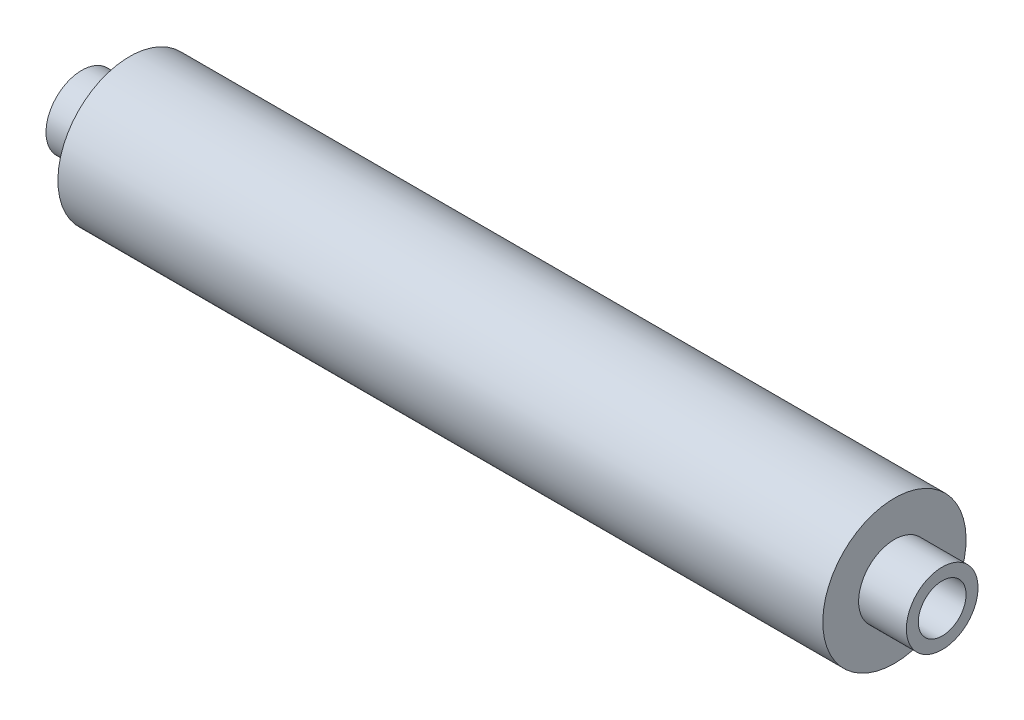
ISO-10303-21;
HEADER;
FILE_DESCRIPTION(('STEP AP214'),'2;1');
FILE_NAME('part.step','',(''),(''),'','','');
FILE_SCHEMA(('AUTOMOTIVE_DESIGN { 1 0 10303 214 1 1 1 1 }'));
ENDSEC;
DATA;
#1=APPLICATION_CONTEXT('core data for automotive mechanical design processes');
#2=APPLICATION_PROTOCOL_DEFINITION('international standard','automotive_design',2000,#1);
#3=PRODUCT_CONTEXT('',#1,'mechanical');
#4=PRODUCT('Part','Part','',(#3));
#5=PRODUCT_RELATED_PRODUCT_CATEGORY('part','',(#4));
#6=PRODUCT_DEFINITION_FORMATION('','',#4);
#7=PRODUCT_DEFINITION_CONTEXT('part definition',#1,'design');
#8=PRODUCT_DEFINITION('design','',#6,#7);
#9=PRODUCT_DEFINITION_SHAPE('','',#8);
#10=(LENGTH_UNIT() NAMED_UNIT(*) SI_UNIT(.MILLI.,.METRE.));
#11=(NAMED_UNIT(*) PLANE_ANGLE_UNIT() SI_UNIT($,.RADIAN.));
#12=(NAMED_UNIT(*) SI_UNIT($,.STERADIAN.) SOLID_ANGLE_UNIT());
#13=UNCERTAINTY_MEASURE_WITH_UNIT(LENGTH_MEASURE(1.E-05),#10,'distance_accuracy_value','');
#14=(GEOMETRIC_REPRESENTATION_CONTEXT(3) GLOBAL_UNCERTAINTY_ASSIGNED_CONTEXT((#13)) GLOBAL_UNIT_ASSIGNED_CONTEXT((#10,
#11,#12)) REPRESENTATION_CONTEXT('',''));
#15=CARTESIAN_POINT('',(0.,0.,0.));
#16=DIRECTION('',(0.,0.,1.));
#17=DIRECTION('',(1.,0.,0.));
#18=AXIS2_PLACEMENT_3D('',#15,#16,#17);
#19=CARTESIAN_POINT('',(45.033,0.,0.));
#20=DIRECTION('',(-1.,0.,0.));
#21=DIRECTION('',(0.,-1.,0.));
#22=AXIS2_PLACEMENT_3D('',#19,#20,#21);
#23=PLANE('',#22);
#24=CARTESIAN_POINT('',(45.033,0.,0.));
#25=DIRECTION('',(1.,0.,0.));
#26=DIRECTION('',(0.,0.,-1.));
#27=AXIS2_PLACEMENT_3D('',#24,#25,#26);
#28=CIRCLE('',#27,2.5);
#29=CARTESIAN_POINT('',(45.033,0.,-2.5));
#30=VERTEX_POINT('',#29);
#31=EDGE_CURVE('E61',#30,#30,#28,.T.);
#32=ORIENTED_EDGE('',*,*,#31,.F.);
#33=EDGE_LOOP('',(#32));
#34=FACE_BOUND('',#33,.T.);
#35=CARTESIAN_POINT('',(45.033,0.,0.));
#36=DIRECTION('',(-1.,0.,0.));
#37=DIRECTION('',(0.,-1.,0.));
#38=AXIS2_PLACEMENT_3D('',#35,#36,#37);
#39=CIRCLE('',#38,3.75000000000001);
#40=CARTESIAN_POINT('',(45.033,-3.75000000000001,0.));
#41=VERTEX_POINT('',#40);
#42=EDGE_CURVE('E10',#41,#41,#39,.T.);
#43=ORIENTED_EDGE('',*,*,#42,.F.);
#44=EDGE_LOOP('',(#43));
#45=FACE_BOUND('',#44,.T.);
#46=ADVANCED_FACE('F35',(#34,#45),#23,.F.);
#47=CARTESIAN_POINT('',(-45.033,0.,0.));
#48=DIRECTION('',(-1.,0.,0.));
#49=DIRECTION('',(0.,-1.,0.));
#50=AXIS2_PLACEMENT_3D('',#47,#48,#49);
#51=CYLINDRICAL_SURFACE('',#50,3.75000000000002);
#52=CARTESIAN_POINT('',(40.033,0.,0.));
#53=DIRECTION('',(-1.,0.,0.));
#54=DIRECTION('',(0.,-1.,0.));
#55=AXIS2_PLACEMENT_3D('',#52,#53,#54);
#56=CIRCLE('',#55,3.75000000000002);
#57=CARTESIAN_POINT('',(40.033,-3.75000000000002,0.));
#58=VERTEX_POINT('',#57);
#59=EDGE_CURVE('E41',#58,#58,#56,.T.);
#60=ORIENTED_EDGE('',*,*,#59,.F.);
#61=EDGE_LOOP('',(#60));
#62=FACE_BOUND('',#61,.T.);
#63=ORIENTED_EDGE('',*,*,#42,.T.);
#64=EDGE_LOOP('',(#63));
#65=FACE_BOUND('',#64,.T.);
#66=ADVANCED_FACE('F85',(#62,#65),#51,.T.);
#67=CARTESIAN_POINT('',(40.033,3.75000000000002,0.));
#68=DIRECTION('',(-1.,0.,0.));
#69=DIRECTION('',(0.,-1.,0.));
#70=AXIS2_PLACEMENT_3D('',#67,#68,#69);
#71=PLANE('',#70);
#72=CARTESIAN_POINT('',(40.033,0.,0.));
#73=DIRECTION('',(-1.,0.,0.));
#74=DIRECTION('',(0.,-1.,0.));
#75=AXIS2_PLACEMENT_3D('',#72,#73,#74);
#76=CIRCLE('',#75,7.50000000000001);
#77=CARTESIAN_POINT('',(40.033,-7.50000000000001,0.));
#78=VERTEX_POINT('',#77);
#79=EDGE_CURVE('E45',#78,#78,#76,.T.);
#80=ORIENTED_EDGE('',*,*,#79,.F.);
#81=EDGE_LOOP('',(#80));
#82=FACE_BOUND('',#81,.T.);
#83=ORIENTED_EDGE('',*,*,#59,.T.);
#84=EDGE_LOOP('',(#83));
#85=FACE_BOUND('',#84,.T.);
#86=ADVANCED_FACE('F90',(#82,#85),#71,.F.);
#87=CARTESIAN_POINT('',(-45.033,0.,0.));
#88=DIRECTION('',(-1.,0.,0.));
#89=DIRECTION('',(0.,-1.,0.));
#90=AXIS2_PLACEMENT_3D('',#87,#88,#89);
#91=CYLINDRICAL_SURFACE('',#90,7.50000000000001);
#92=CARTESIAN_POINT('',(-40.033,0.,0.));
#93=DIRECTION('',(-1.,0.,0.));
#94=DIRECTION('',(0.,-1.,0.));
#95=AXIS2_PLACEMENT_3D('',#92,#93,#94);
#96=CIRCLE('',#95,7.5);
#97=CARTESIAN_POINT('',(-40.033,-7.49999999999999,0.));
#98=VERTEX_POINT('',#97);
#99=EDGE_CURVE('E49',#98,#98,#96,.T.);
#100=ORIENTED_EDGE('',*,*,#99,.F.);
#101=EDGE_LOOP('',(#100));
#102=FACE_BOUND('',#101,.T.);
#103=ORIENTED_EDGE('',*,*,#79,.T.);
#104=EDGE_LOOP('',(#103));
#105=FACE_BOUND('',#104,.T.);
#106=ADVANCED_FACE('F117',(#102,#105),#91,.T.);
#107=CARTESIAN_POINT('',(-40.033,7.50000000000001,0.));
#108=DIRECTION('',(1.,0.,0.));
#109=DIRECTION('',(0.,1.,0.));
#110=AXIS2_PLACEMENT_3D('',#107,#108,#109);
#111=PLANE('',#110);
#112=CARTESIAN_POINT('',(-40.033,0.,0.));
#113=DIRECTION('',(-1.,0.,0.));
#114=DIRECTION('',(0.,-1.,0.));
#115=AXIS2_PLACEMENT_3D('',#112,#113,#114);
#116=CIRCLE('',#115,3.75000000000001);
#117=CARTESIAN_POINT('',(-40.033,-3.75,0.));
#118=VERTEX_POINT('',#117);
#119=EDGE_CURVE('E54',#118,#118,#116,.T.);
#120=ORIENTED_EDGE('',*,*,#119,.F.);
#121=EDGE_LOOP('',(#120));
#122=FACE_BOUND('',#121,.T.);
#123=ORIENTED_EDGE('',*,*,#99,.T.);
#124=EDGE_LOOP('',(#123));
#125=FACE_BOUND('',#124,.T.);
#126=ADVANCED_FACE('F113',(#122,#125),#111,.F.);
#127=CARTESIAN_POINT('',(-45.033,0.,0.));
#128=DIRECTION('',(-1.,0.,0.));
#129=DIRECTION('',(0.,-1.,0.));
#130=AXIS2_PLACEMENT_3D('',#127,#128,#129);
#131=CYLINDRICAL_SURFACE('',#130,3.75000000000001);
#132=CARTESIAN_POINT('',(-45.033,0.,0.));
#133=DIRECTION('',(-1.,0.,0.));
#134=DIRECTION('',(0.,-1.,0.));
#135=AXIS2_PLACEMENT_3D('',#132,#133,#134);
#136=CIRCLE('',#135,3.75000000000001);
#137=CARTESIAN_POINT('',(-45.033,-3.75,0.));
#138=VERTEX_POINT('',#137);
#139=EDGE_CURVE('E57',#138,#138,#136,.T.);
#140=ORIENTED_EDGE('',*,*,#139,.F.);
#141=EDGE_LOOP('',(#140));
#142=FACE_BOUND('',#141,.T.);
#143=ORIENTED_EDGE('',*,*,#119,.T.);
#144=EDGE_LOOP('',(#143));
#145=FACE_BOUND('',#144,.T.);
#146=ADVANCED_FACE('F106',(#142,#145),#131,.T.);
#147=CARTESIAN_POINT('',(-45.033,3.75000000000002,0.));
#148=DIRECTION('',(1.,0.,0.));
#149=DIRECTION('',(0.,1.,0.));
#150=AXIS2_PLACEMENT_3D('',#147,#148,#149);
#151=PLANE('',#150);
#152=CARTESIAN_POINT('',(-45.033,0.,0.));
#153=DIRECTION('',(1.,0.,0.));
#154=DIRECTION('',(0.,0.,-1.));
#155=AXIS2_PLACEMENT_3D('',#152,#153,#154);
#156=CIRCLE('',#155,2.5);
#157=CARTESIAN_POINT('',(-45.033,0.,-2.5));
#158=VERTEX_POINT('',#157);
#159=EDGE_CURVE('E67',#158,#158,#156,.T.);
#160=ORIENTED_EDGE('',*,*,#159,.T.);
#161=EDGE_LOOP('',(#160));
#162=FACE_BOUND('',#161,.T.);
#163=ORIENTED_EDGE('',*,*,#139,.T.);
#164=EDGE_LOOP('',(#163));
#165=FACE_BOUND('',#164,.T.);
#166=ADVANCED_FACE('F97',(#162,#165),#151,.F.);
#167=CARTESIAN_POINT('',(25.033,0.,0.));
#168=DIRECTION('',(1.,0.,0.));
#169=DIRECTION('',(0.,0.,-1.));
#170=AXIS2_PLACEMENT_3D('',#167,#168,#169);
#171=CYLINDRICAL_SURFACE('',#170,2.5);
#172=CARTESIAN_POINT('',(25.033,0.,0.));
#173=DIRECTION('',(1.,0.,0.));
#174=DIRECTION('',(0.,0.,-1.));
#175=AXIS2_PLACEMENT_3D('',#172,#173,#174);
#176=CIRCLE('',#175,2.5);
#177=CARTESIAN_POINT('',(25.033,0.,-2.5));
#178=VERTEX_POINT('',#177);
#179=EDGE_CURVE('E60',#178,#178,#176,.T.);
#180=ORIENTED_EDGE('',*,*,#179,.F.);
#181=EDGE_LOOP('',(#180));
#182=FACE_BOUND('',#181,.T.);
#183=ORIENTED_EDGE('',*,*,#31,.T.);
#184=EDGE_LOOP('',(#183));
#185=FACE_BOUND('',#184,.T.);
#186=ADVANCED_FACE('F95',(#182,#185),#171,.F.);
#187=CARTESIAN_POINT('',(25.033,0.,0.));
#188=DIRECTION('',(1.,0.,0.));
#189=DIRECTION('',(0.,0.,-1.));
#190=AXIS2_PLACEMENT_3D('',#187,#188,#189);
#191=PLANE('',#190);
#192=ORIENTED_EDGE('',*,*,#179,.T.);
#193=EDGE_LOOP('',(#192));
#194=FACE_BOUND('',#193,.T.);
#195=ADVANCED_FACE('F82',(#194),#191,.T.);
#196=CARTESIAN_POINT('',(-25.033,0.,0.));
#197=DIRECTION('',(-1.,0.,0.));
#198=DIRECTION('',(0.,0.,1.));
#199=AXIS2_PLACEMENT_3D('',#196,#197,#198);
#200=CYLINDRICAL_SURFACE('',#199,2.5);
#201=CARTESIAN_POINT('',(-25.033,0.,0.));
#202=DIRECTION('',(1.,0.,0.));
#203=DIRECTION('',(0.,0.,-1.));
#204=AXIS2_PLACEMENT_3D('',#201,#202,#203);
#205=CIRCLE('',#204,2.5);
#206=CARTESIAN_POINT('',(-25.033,0.,-2.5));
#207=VERTEX_POINT('',#206);
#208=EDGE_CURVE('E64',#207,#207,#205,.T.);
#209=ORIENTED_EDGE('',*,*,#208,.T.);
#210=EDGE_LOOP('',(#209));
#211=FACE_BOUND('',#210,.T.);
#212=ORIENTED_EDGE('',*,*,#159,.F.);
#213=EDGE_LOOP('',(#212));
#214=FACE_BOUND('',#213,.T.);
#215=ADVANCED_FACE('F73',(#211,#214),#200,.F.);
#216=CARTESIAN_POINT('',(-25.033,0.,0.));
#217=DIRECTION('',(-1.,0.,0.));
#218=DIRECTION('',(0.,0.,-1.));
#219=AXIS2_PLACEMENT_3D('',#216,#217,#218);
#220=PLANE('',#219);
#221=ORIENTED_EDGE('',*,*,#208,.F.);
#222=EDGE_LOOP('',(#221));
#223=FACE_BOUND('',#222,.T.);
#224=ADVANCED_FACE('F76',(#223),#220,.T.);
#225=CLOSED_SHELL('',(#46,#66,#86,#106,#126,#146,#166,#186,#195,#215,#224));
#226=MANIFOLD_SOLID_BREP('B2',#225);
#227=ADVANCED_BREP_SHAPE_REPRESENTATION('',(#18,#226),#14);
#228=SHAPE_DEFINITION_REPRESENTATION(#9,#227);
ENDSEC;
END-ISO-10303-21;
